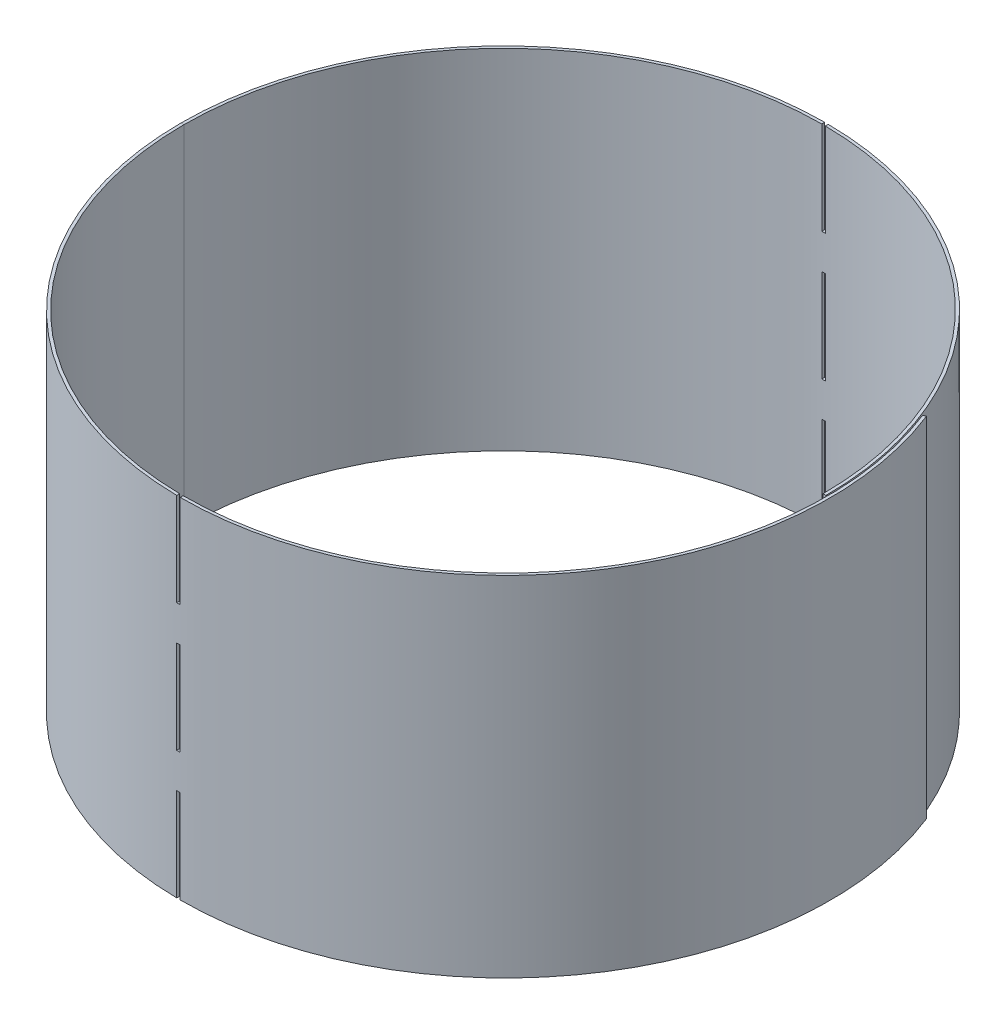
ISO-10303-21;
HEADER;
FILE_DESCRIPTION(('STEP AP214'),'2;1');
FILE_NAME('part.step','',(''),(''),'','','');
FILE_SCHEMA(('AUTOMOTIVE_DESIGN { 1 0 10303 214 1 1 1 1 }'));
ENDSEC;
DATA;
#1=APPLICATION_CONTEXT('core data for automotive mechanical design processes');
#2=APPLICATION_PROTOCOL_DEFINITION('international standard','automotive_design',2000,#1);
#3=PRODUCT_CONTEXT('',#1,'mechanical');
#4=PRODUCT('Part','Part','',(#3));
#5=PRODUCT_RELATED_PRODUCT_CATEGORY('part','',(#4));
#6=PRODUCT_DEFINITION_FORMATION('','',#4);
#7=PRODUCT_DEFINITION_CONTEXT('part definition',#1,'design');
#8=PRODUCT_DEFINITION('design','',#6,#7);
#9=PRODUCT_DEFINITION_SHAPE('','',#8);
#10=(LENGTH_UNIT() NAMED_UNIT(*) SI_UNIT(.MILLI.,.METRE.));
#11=(NAMED_UNIT(*) PLANE_ANGLE_UNIT() SI_UNIT($,.RADIAN.));
#12=(NAMED_UNIT(*) SI_UNIT($,.STERADIAN.) SOLID_ANGLE_UNIT());
#13=UNCERTAINTY_MEASURE_WITH_UNIT(LENGTH_MEASURE(1.E-05),#10,'distance_accuracy_value','');
#14=(GEOMETRIC_REPRESENTATION_CONTEXT(3) GLOBAL_UNCERTAINTY_ASSIGNED_CONTEXT((#13)) GLOBAL_UNIT_ASSIGNED_CONTEXT((#10,
#11,#12)) REPRESENTATION_CONTEXT('',''));
#15=CARTESIAN_POINT('',(0.,0.,0.));
#16=DIRECTION('',(0.,0.,1.));
#17=DIRECTION('',(1.,0.,0.));
#18=AXIS2_PLACEMENT_3D('',#15,#16,#17);
#19=CARTESIAN_POINT('',(0.,-19.,0.));
#20=DIRECTION('',(0.,-1.,0.));
#21=DIRECTION('',(0.,0.,-1.));
#22=AXIS2_PLACEMENT_3D('',#19,#20,#21);
#23=PLANE('',#22);
#24=DIRECTION('',(-0.00699536476308544,0.,0.999975532136578));
#25=VECTOR('',#24,1.);
#26=CARTESIAN_POINT('',(0.19237253098485,-19.,-27.4993271337559));
#27=LINE('',#26,#25);
#28=CARTESIAN_POINT('',(0.194121372175624,-18.9999999999999,-27.74932101679));
#29=VERTEX_POINT('',#28);
#30=CARTESIAN_POINT('',(0.19237253098485,-19.,-27.4993271337559));
#31=VERTEX_POINT('',#30);
#32=EDGE_CURVE('E143',#29,#31,#27,.T.);
#33=ORIENTED_EDGE('',*,*,#32,.F.);
#34=CARTESIAN_POINT('',(0.,-18.9999999999999,0.));
#35=DIRECTION('',(0.,-1.,0.));
#36=DIRECTION('',(0.,0.,-1.));
#37=AXIS2_PLACEMENT_3D('',#34,#35,#36);
#38=CIRCLE('',#37,27.75);
#39=CARTESIAN_POINT('',(-0.107234243740931,-18.9999999999999,-27.7497928067395));
#40=VERTEX_POINT('',#39);
#41=EDGE_CURVE('E395',#29,#40,#38,.F.);
#42=ORIENTED_EDGE('',*,*,#41,.T.);
#43=DIRECTION('',(0.00386429707174401,0.,0.999992533576197));
#44=VECTOR('',#43,1.);
#45=CARTESIAN_POINT('',(-0.10626816947296,-19.,-27.4997946733454));
#46=LINE('',#45,#44);
#47=CARTESIAN_POINT('',(-0.10626816947296,-19.,-27.4997946733454));
#48=VERTEX_POINT('',#47);
#49=EDGE_CURVE('E394',#40,#48,#46,.T.);
#50=ORIENTED_EDGE('',*,*,#49,.T.);
#51=CARTESIAN_POINT('',(0.,-19.,0.));
#52=DIRECTION('',(0.,1.,0.));
#53=DIRECTION('',(0.,0.,1.));
#54=AXIS2_PLACEMENT_3D('',#51,#52,#53);
#55=CIRCLE('',#54,27.5);
#56=EDGE_CURVE('E291',#31,#48,#55,.T.);
#57=ORIENTED_EDGE('',*,*,#56,.F.);
#58=EDGE_LOOP('',(#33,#42,#50,#57));
#59=FACE_BOUND('',#58,.T.);
#60=ADVANCED_FACE('F38',(#59),#23,.F.);
#61=CARTESIAN_POINT('',(0.192372530984853,-15.,-27.4993271337559));
#62=DIRECTION('',(0.999975532136578,0.,0.00699536476308556));
#63=DIRECTION('',(0.,-1.,0.));
#64=AXIS2_PLACEMENT_3D('',#61,#62,#63);
#65=PLANE('',#64);
#66=DIRECTION('',(-0.00699536476308569,0.,0.999975532136578));
#67=VECTOR('',#66,1.);
#68=CARTESIAN_POINT('',(0.192372530984856,-11.,-27.4993271337559));
#69=LINE('',#68,#67);
#70=CARTESIAN_POINT('',(0.194121372175624,-10.9999999999999,-27.74932101679));
#71=VERTEX_POINT('',#70);
#72=CARTESIAN_POINT('',(0.192372530984856,-11.,-27.4993271337559));
#73=VERTEX_POINT('',#72);
#74=EDGE_CURVE('E385',#71,#73,#69,.T.);
#75=ORIENTED_EDGE('',*,*,#74,.F.);
#76=DIRECTION('',(0.,-1.,0.));
#77=VECTOR('',#76,1.);
#78=CARTESIAN_POINT('',(0.194121372175624,76.8256966820841,-27.74932101679));
#79=LINE('',#78,#77);
#80=EDGE_CURVE('E391',#71,#29,#79,.T.);
#81=ORIENTED_EDGE('',*,*,#80,.T.);
#82=ORIENTED_EDGE('',*,*,#32,.T.);
#83=DIRECTION('',(0.,-1.,0.));
#84=VECTOR('',#83,1.);
#85=CARTESIAN_POINT('',(0.192372530984856,-11.,-27.4993271337559));
#86=LINE('',#85,#84);
#87=EDGE_CURVE('E294',#73,#31,#86,.T.);
#88=ORIENTED_EDGE('',*,*,#87,.F.);
#89=EDGE_LOOP('',(#75,#81,#82,#88));
#90=FACE_BOUND('',#89,.T.);
#91=ADVANCED_FACE('F571',(#90),#65,.F.);
#92=CARTESIAN_POINT('',(0.,-11.,0.));
#93=DIRECTION('',(0.,1.,0.));
#94=DIRECTION('',(0.,0.,1.));
#95=AXIS2_PLACEMENT_3D('',#92,#93,#94);
#96=PLANE('',#95);
#97=CARTESIAN_POINT('',(0.,-10.9999999999999,0.));
#98=DIRECTION('',(0.,-1.,0.));
#99=DIRECTION('',(0.,0.,-1.));
#100=AXIS2_PLACEMENT_3D('',#97,#98,#99);
#101=CIRCLE('',#100,27.75);
#102=CARTESIAN_POINT('',(-0.107234243740931,-10.9999999999999,-27.7497928067395));
#103=VERTEX_POINT('',#102);
#104=EDGE_CURVE('E387',#103,#71,#101,.T.);
#105=ORIENTED_EDGE('',*,*,#104,.T.);
#106=ORIENTED_EDGE('',*,*,#74,.T.);
#107=CARTESIAN_POINT('',(0.,-11.,0.));
#108=DIRECTION('',(0.,-1.,0.));
#109=DIRECTION('',(0.,0.,-1.));
#110=AXIS2_PLACEMENT_3D('',#107,#108,#109);
#111=CIRCLE('',#110,27.5);
#112=CARTESIAN_POINT('',(-0.106268169472984,-11.,-27.4997946733454));
#113=VERTEX_POINT('',#112);
#114=EDGE_CURVE('E297',#113,#73,#111,.T.);
#115=ORIENTED_EDGE('',*,*,#114,.F.);
#116=DIRECTION('',(0.00386429707174487,0.,0.999992533576197));
#117=VECTOR('',#116,1.);
#118=CARTESIAN_POINT('',(-0.106268169472984,-11.,-27.4997946733454));
#119=LINE('',#118,#117);
#120=EDGE_CURVE('E380',#103,#113,#119,.T.);
#121=ORIENTED_EDGE('',*,*,#120,.F.);
#122=EDGE_LOOP('',(#105,#106,#115,#121));
#123=FACE_BOUND('',#122,.T.);
#124=ADVANCED_FACE('F567',(#123),#96,.F.);
#125=CARTESIAN_POINT('',(-0.106268169472984,-15.,-27.4997946733454));
#126=DIRECTION('',(-0.999992533576197,0.,0.00386429707174487));
#127=DIRECTION('',(0.,1.,0.));
#128=AXIS2_PLACEMENT_3D('',#125,#126,#127);
#129=PLANE('',#128);
#130=ORIENTED_EDGE('',*,*,#49,.F.);
#131=DIRECTION('',(0.,-1.,0.));
#132=VECTOR('',#131,1.);
#133=CARTESIAN_POINT('',(-0.107234243740931,76.8256966820841,-27.7497928067395));
#134=LINE('',#133,#132);
#135=EDGE_CURVE('E382',#40,#103,#134,.F.);
#136=ORIENTED_EDGE('',*,*,#135,.T.);
#137=ORIENTED_EDGE('',*,*,#120,.T.);
#138=DIRECTION('',(0.,1.,0.));
#139=VECTOR('',#138,1.);
#140=CARTESIAN_POINT('',(-0.106268169472984,-19.,-27.4997946733454));
#141=LINE('',#140,#139);
#142=EDGE_CURVE('E300',#48,#113,#141,.T.);
#143=ORIENTED_EDGE('',*,*,#142,.F.);
#144=EDGE_LOOP('',(#130,#136,#137,#143));
#145=FACE_BOUND('',#144,.T.);
#146=ADVANCED_FACE('F560',(#145),#129,.F.);
#147=CARTESIAN_POINT('',(-0.106268169472977,-3.99999999999997,-27.4997946733454));
#148=DIRECTION('',(-0.999992533576197,0.,0.00386429707174462));
#149=DIRECTION('',(0.,1.,0.));
#150=AXIS2_PLACEMENT_3D('',#147,#148,#149);
#151=PLANE('',#150);
#152=DIRECTION('',(0.00386429707174401,0.,0.999992533576197));
#153=VECTOR('',#152,1.);
#154=CARTESIAN_POINT('',(-0.10626816947296,-7.99999999999997,-27.4997946733454));
#155=LINE('',#154,#153);
#156=CARTESIAN_POINT('',(-0.107234243740931,-7.99999999999992,-27.7497928067395));
#157=VERTEX_POINT('',#156);
#158=CARTESIAN_POINT('',(-0.10626816947296,-7.99999999999997,-27.4997946733454));
#159=VERTEX_POINT('',#158);
#160=EDGE_CURVE('E371',#157,#159,#155,.T.);
#161=ORIENTED_EDGE('',*,*,#160,.F.);
#162=DIRECTION('',(0.,-1.,0.));
#163=VECTOR('',#162,1.);
#164=CARTESIAN_POINT('',(-0.107234243740931,76.8256966820841,-27.7497928067395));
#165=LINE('',#164,#163);
#166=CARTESIAN_POINT('',(-0.107234243740931,0.,-27.7497928067395));
#167=VERTEX_POINT('',#166);
#168=EDGE_CURVE('E377',#157,#167,#165,.F.);
#169=ORIENTED_EDGE('',*,*,#168,.T.);
#170=DIRECTION('',(0.00386429707174462,0.,0.999992533576197));
#171=VECTOR('',#170,1.);
#172=CARTESIAN_POINT('',(-0.106268169472977,0.,-27.4997946733454));
#173=LINE('',#172,#171);
#174=CARTESIAN_POINT('',(-0.106268169472977,0.,-27.4997946733454));
#175=VERTEX_POINT('',#174);
#176=EDGE_CURVE('E57',#167,#175,#173,.T.);
#177=ORIENTED_EDGE('',*,*,#176,.T.);
#178=DIRECTION('',(0.,1.,0.));
#179=VECTOR('',#178,1.);
#180=CARTESIAN_POINT('',(-0.106268169472977,-7.99999999999997,-27.4997946733454));
#181=LINE('',#180,#179);
#182=EDGE_CURVE('E309',#159,#175,#181,.T.);
#183=ORIENTED_EDGE('',*,*,#182,.F.);
#184=EDGE_LOOP('',(#161,#169,#177,#183));
#185=FACE_BOUND('',#184,.T.);
#186=ADVANCED_FACE('F558',(#185),#151,.F.);
#187=CARTESIAN_POINT('',(0.,-7.99999999999997,0.));
#188=DIRECTION('',(0.,-1.,0.));
#189=DIRECTION('',(0.,0.,-1.));
#190=AXIS2_PLACEMENT_3D('',#187,#188,#189);
#191=PLANE('',#190);
#192=DIRECTION('',(-0.00699536476308569,0.,0.999975532136578));
#193=VECTOR('',#192,1.);
#194=CARTESIAN_POINT('',(0.192372530984856,-7.99999999999997,-27.4993271337559));
#195=LINE('',#194,#193);
#196=CARTESIAN_POINT('',(0.194121372175635,-7.99999999999992,-27.74932101679));
#197=VERTEX_POINT('',#196);
#198=CARTESIAN_POINT('',(0.192372530984856,-7.99999999999997,-27.4993271337559));
#199=VERTEX_POINT('',#198);
#200=EDGE_CURVE('E366',#197,#199,#195,.T.);
#201=ORIENTED_EDGE('',*,*,#200,.F.);
#202=CARTESIAN_POINT('',(0.,-7.99999999999994,0.));
#203=DIRECTION('',(0.,-1.,0.));
#204=DIRECTION('',(0.,0.,-1.));
#205=AXIS2_PLACEMENT_3D('',#202,#203,#204);
#206=CIRCLE('',#205,27.75);
#207=EDGE_CURVE('E373',#197,#157,#206,.F.);
#208=ORIENTED_EDGE('',*,*,#207,.T.);
#209=ORIENTED_EDGE('',*,*,#160,.T.);
#210=CARTESIAN_POINT('',(0.,-7.99999999999997,0.));
#211=DIRECTION('',(0.,1.,0.));
#212=DIRECTION('',(0.,0.,1.));
#213=AXIS2_PLACEMENT_3D('',#210,#211,#212);
#214=CIRCLE('',#213,27.5);
#215=EDGE_CURVE('E312',#199,#159,#214,.T.);
#216=ORIENTED_EDGE('',*,*,#215,.F.);
#217=EDGE_LOOP('',(#201,#208,#209,#216));
#218=FACE_BOUND('',#217,.T.);
#219=ADVANCED_FACE('F556',(#218),#191,.F.);
#220=CARTESIAN_POINT('',(0.192372530984863,-3.99999999999997,-27.4993271337559));
#221=DIRECTION('',(0.999975532136578,0.,0.00699536476308594));
#222=DIRECTION('',(0.,-1.,0.));
#223=AXIS2_PLACEMENT_3D('',#220,#221,#222);
#224=PLANE('',#223);
#225=DIRECTION('',(-0.00699536476308647,0.,0.999975532136578));
#226=VECTOR('',#225,1.);
#227=CARTESIAN_POINT('',(0.192372530984878,0.,-27.4993271337559));
#228=LINE('',#227,#226);
#229=CARTESIAN_POINT('',(0.194121372175635,0.,-27.74932101679));
#230=VERTEX_POINT('',#229);
#231=CARTESIAN_POINT('',(0.192372530984878,0.,-27.4993271337559));
#232=VERTEX_POINT('',#231);
#233=EDGE_CURVE('E361',#230,#232,#228,.T.);
#234=ORIENTED_EDGE('',*,*,#233,.F.);
#235=DIRECTION('',(0.,-1.,0.));
#236=VECTOR('',#235,1.);
#237=CARTESIAN_POINT('',(0.194121372175635,76.8256966820841,-27.74932101679));
#238=LINE('',#237,#236);
#239=EDGE_CURVE('E368',#230,#197,#238,.T.);
#240=ORIENTED_EDGE('',*,*,#239,.T.);
#241=ORIENTED_EDGE('',*,*,#200,.T.);
#242=DIRECTION('',(0.,-1.,0.));
#243=VECTOR('',#242,1.);
#244=CARTESIAN_POINT('',(0.19237253098487,0.,-27.4993271337559));
#245=LINE('',#244,#243);
#246=EDGE_CURVE('E315',#232,#199,#245,.T.);
#247=ORIENTED_EDGE('',*,*,#246,.F.);
#248=EDGE_LOOP('',(#234,#240,#241,#247));
#249=FACE_BOUND('',#248,.T.);
#250=ADVANCED_FACE('F554',(#249),#224,.F.);
#251=CARTESIAN_POINT('',(0.,0.,0.));
#252=DIRECTION('',(0.,-1.,0.));
#253=DIRECTION('',(1.,0.,0.));
#254=AXIS2_PLACEMENT_3D('',#251,#252,#253);
#255=PLANE('',#254);
#256=DIRECTION('',(-1.,0.,0.));
#257=VECTOR('',#256,1.);
#258=CARTESIAN_POINT('',(27.5,0.,0.));
#259=LINE('',#258,#257);
#260=CARTESIAN_POINT('',(27.75,0.,0.));
#261=VERTEX_POINT('',#260);
#262=CARTESIAN_POINT('',(27.5,0.,0.));
#263=VERTEX_POINT('',#262);
#264=EDGE_CURVE('E356',#261,#263,#259,.T.);
#265=ORIENTED_EDGE('',*,*,#264,.F.);
#266=CARTESIAN_POINT('',(0.,0.,0.));
#267=DIRECTION('',(0.,-1.,0.));
#268=DIRECTION('',(0.,0.,-1.));
#269=AXIS2_PLACEMENT_3D('',#266,#267,#268);
#270=CIRCLE('',#269,27.75);
#271=EDGE_CURVE('E363',#261,#230,#270,.F.);
#272=ORIENTED_EDGE('',*,*,#271,.T.);
#273=ORIENTED_EDGE('',*,*,#233,.T.);
#274=CARTESIAN_POINT('',(0.,0.,0.));
#275=DIRECTION('',(0.,1.,0.));
#276=DIRECTION('',(-1.,0.,0.));
#277=AXIS2_PLACEMENT_3D('',#274,#275,#276);
#278=CIRCLE('',#277,27.5);
#279=EDGE_CURVE('E318',#263,#232,#278,.T.);
#280=ORIENTED_EDGE('',*,*,#279,.F.);
#281=EDGE_LOOP('',(#265,#272,#273,#280));
#282=FACE_BOUND('',#281,.T.);
#283=ADVANCED_FACE('F549',(#282),#255,.F.);
#284=CARTESIAN_POINT('',(27.5,-15.,0.));
#285=DIRECTION('',(0.,0.,-1.));
#286=DIRECTION('',(0.,1.,0.));
#287=AXIS2_PLACEMENT_3D('',#284,#285,#286);
#288=PLANE('',#287);
#289=DIRECTION('',(-1.,0.,0.));
#290=VECTOR('',#289,1.);
#291=CARTESIAN_POINT('',(27.5,-30.,0.));
#292=LINE('',#291,#290);
#293=CARTESIAN_POINT('',(27.75,-29.9999999999999,0.));
#294=VERTEX_POINT('',#293);
#295=CARTESIAN_POINT('',(27.5,-30.,0.));
#296=VERTEX_POINT('',#295);
#297=EDGE_CURVE('E351',#294,#296,#292,.T.);
#298=ORIENTED_EDGE('',*,*,#297,.F.);
#299=DIRECTION('',(0.,-1.,0.));
#300=VECTOR('',#299,1.);
#301=CARTESIAN_POINT('',(27.75,76.8256966820841,0.));
#302=LINE('',#301,#300);
#303=EDGE_CURVE('E358',#294,#261,#302,.F.);
#304=ORIENTED_EDGE('',*,*,#303,.T.);
#305=ORIENTED_EDGE('',*,*,#264,.T.);
#306=DIRECTION('',(0.,1.,0.));
#307=VECTOR('',#306,1.);
#308=CARTESIAN_POINT('',(27.5,-30.,0.));
#309=LINE('',#308,#307);
#310=EDGE_CURVE('E321',#296,#263,#309,.T.);
#311=ORIENTED_EDGE('',*,*,#310,.F.);
#312=EDGE_LOOP('',(#298,#304,#305,#311));
#313=FACE_BOUND('',#312,.T.);
#314=ADVANCED_FACE('F543',(#313),#288,.F.);
#315=CARTESIAN_POINT('',(0.,-30.,0.));
#316=DIRECTION('',(0.,1.,0.));
#317=DIRECTION('',(0.,0.,1.));
#318=AXIS2_PLACEMENT_3D('',#315,#316,#317);
#319=PLANE('',#318);
#320=DIRECTION('',(-0.00699536476308506,0.,0.999975532136578));
#321=VECTOR('',#320,1.);
#322=CARTESIAN_POINT('',(0.192372530984839,-30.,-27.4993271337559));
#323=LINE('',#322,#321);
#324=CARTESIAN_POINT('',(0.194121372175614,-29.9999999999999,-27.74932101679));
#325=VERTEX_POINT('',#324);
#326=CARTESIAN_POINT('',(0.192372530984839,-30.,-27.4993271337559));
#327=VERTEX_POINT('',#326);
#328=EDGE_CURVE('E346',#325,#327,#323,.T.);
#329=ORIENTED_EDGE('',*,*,#328,.F.);
#330=CARTESIAN_POINT('',(0.,-29.9999999999999,0.));
#331=DIRECTION('',(0.,-1.,0.));
#332=DIRECTION('',(0.,0.,-1.));
#333=AXIS2_PLACEMENT_3D('',#330,#331,#332);
#334=CIRCLE('',#333,27.75);
#335=EDGE_CURVE('E353',#325,#294,#334,.T.);
#336=ORIENTED_EDGE('',*,*,#335,.T.);
#337=ORIENTED_EDGE('',*,*,#297,.T.);
#338=CARTESIAN_POINT('',(0.,-30.,0.));
#339=DIRECTION('',(0.,-1.,0.));
#340=DIRECTION('',(0.,0.,-1.));
#341=AXIS2_PLACEMENT_3D('',#338,#339,#340);
#342=CIRCLE('',#341,27.5);
#343=EDGE_CURVE('E324',#327,#296,#342,.T.);
#344=ORIENTED_EDGE('',*,*,#343,.F.);
#345=EDGE_LOOP('',(#329,#336,#337,#344));
#346=FACE_BOUND('',#345,.T.);
#347=ADVANCED_FACE('F539',(#346),#319,.F.);
#348=CARTESIAN_POINT('',(0.192372530984843,-26.,-27.4993271337559));
#349=DIRECTION('',(0.999975532136578,0.,0.00699536476308519));
#350=DIRECTION('',(0.,-1.,0.));
#351=AXIS2_PLACEMENT_3D('',#348,#349,#350);
#352=PLANE('',#351);
#353=DIRECTION('',(-0.00699536476308531,0.,0.999975532136578));
#354=VECTOR('',#353,1.);
#355=CARTESIAN_POINT('',(0.192372530984846,-22.,-27.4993271337559));
#356=LINE('',#355,#354);
#357=CARTESIAN_POINT('',(0.194121372175614,-22.,-27.74932101679));
#358=VERTEX_POINT('',#357);
#359=CARTESIAN_POINT('',(0.192372530984846,-22.,-27.4993271337559));
#360=VERTEX_POINT('',#359);
#361=EDGE_CURVE('E341',#358,#360,#356,.T.);
#362=ORIENTED_EDGE('',*,*,#361,.F.);
#363=DIRECTION('',(0.,-1.,0.));
#364=VECTOR('',#363,1.);
#365=CARTESIAN_POINT('',(0.194121372175614,76.8256966820841,-27.74932101679));
#366=LINE('',#365,#364);
#367=EDGE_CURVE('E348',#358,#325,#366,.T.);
#368=ORIENTED_EDGE('',*,*,#367,.T.);
#369=ORIENTED_EDGE('',*,*,#328,.T.);
#370=DIRECTION('',(0.,-1.,0.));
#371=VECTOR('',#370,1.);
#372=CARTESIAN_POINT('',(0.192372530984846,-22.,-27.4993271337559));
#373=LINE('',#372,#371);
#374=EDGE_CURVE('E327',#360,#327,#373,.T.);
#375=ORIENTED_EDGE('',*,*,#374,.F.);
#376=EDGE_LOOP('',(#362,#368,#369,#375));
#377=FACE_BOUND('',#376,.T.);
#378=ADVANCED_FACE('F743',(#377),#352,.F.);
#379=CARTESIAN_POINT('',(0.,-22.,0.));
#380=DIRECTION('',(0.,1.,0.));
#381=DIRECTION('',(0.,0.,1.));
#382=AXIS2_PLACEMENT_3D('',#379,#380,#381);
#383=PLANE('',#382);
#384=CARTESIAN_POINT('',(0.,-22.,0.));
#385=DIRECTION('',(0.,-1.,0.));
#386=DIRECTION('',(0.,0.,-1.));
#387=AXIS2_PLACEMENT_3D('',#384,#385,#386);
#388=CIRCLE('',#387,27.75);
#389=CARTESIAN_POINT('',(-0.107234243740931,-22.,-27.7497928067395));
#390=VERTEX_POINT('',#389);
#391=EDGE_CURVE('E343',#390,#358,#388,.T.);
#392=ORIENTED_EDGE('',*,*,#391,.T.);
#393=ORIENTED_EDGE('',*,*,#361,.T.);
#394=CARTESIAN_POINT('',(0.,-22.,0.));
#395=DIRECTION('',(0.,-1.,0.));
#396=DIRECTION('',(0.,0.,-1.));
#397=AXIS2_PLACEMENT_3D('',#394,#395,#396);
#398=CIRCLE('',#397,27.5);
#399=CARTESIAN_POINT('',(-0.106268169472994,-22.,-27.4997946733454));
#400=VERTEX_POINT('',#399);
#401=EDGE_CURVE('E330',#400,#360,#398,.T.);
#402=ORIENTED_EDGE('',*,*,#401,.F.);
#403=DIRECTION('',(0.00386429707174525,0.,0.999992533576197));
#404=VECTOR('',#403,1.);
#405=CARTESIAN_POINT('',(-0.106268169472994,-22.,-27.4997946733454));
#406=LINE('',#405,#404);
#407=EDGE_CURVE('E336',#390,#400,#406,.T.);
#408=ORIENTED_EDGE('',*,*,#407,.F.);
#409=EDGE_LOOP('',(#392,#393,#402,#408));
#410=FACE_BOUND('',#409,.T.);
#411=ADVANCED_FACE('F533',(#410),#383,.F.);
#412=CARTESIAN_POINT('',(-0.106268169472994,-26.,-27.4997946733454));
#413=DIRECTION('',(-0.999992533576197,0.,0.00386429707174525));
#414=DIRECTION('',(0.,1.,0.));
#415=AXIS2_PLACEMENT_3D('',#412,#413,#414);
#416=PLANE('',#415);
#417=DIRECTION('',(0.00386429707174527,0.,0.999992533576197));
#418=VECTOR('',#417,1.);
#419=CARTESIAN_POINT('',(-0.106268169472995,-30.,-27.4997946733454));
#420=LINE('',#419,#418);
#421=CARTESIAN_POINT('',(-0.107234243740931,-29.9999999999999,-27.7497928067395));
#422=VERTEX_POINT('',#421);
#423=CARTESIAN_POINT('',(-0.106268169472995,-30.,-27.4997946733454));
#424=VERTEX_POINT('',#423);
#425=EDGE_CURVE('E283',#422,#424,#420,.T.);
#426=ORIENTED_EDGE('',*,*,#425,.F.);
#427=DIRECTION('',(0.,-1.,0.));
#428=VECTOR('',#427,1.);
#429=CARTESIAN_POINT('',(-0.107234243740931,76.8256966820841,-27.7497928067395));
#430=LINE('',#429,#428);
#431=EDGE_CURVE('E338',#422,#390,#430,.F.);
#432=ORIENTED_EDGE('',*,*,#431,.T.);
#433=ORIENTED_EDGE('',*,*,#407,.T.);
#434=DIRECTION('',(0.,1.,0.));
#435=VECTOR('',#434,1.);
#436=CARTESIAN_POINT('',(-0.106268169472994,-30.,-27.4997946733454));
#437=LINE('',#436,#435);
#438=EDGE_CURVE('E333',#424,#400,#437,.T.);
#439=ORIENTED_EDGE('',*,*,#438,.F.);
#440=EDGE_LOOP('',(#426,#432,#433,#439));
#441=FACE_BOUND('',#440,.T.);
#442=ADVANCED_FACE('F530',(#441),#416,.F.);
#443=CARTESIAN_POINT('',(0.,76.8256966820841,0.));
#444=DIRECTION('',(0.,-1.,0.));
#445=DIRECTION('',(0.,0.,-1.));
#446=AXIS2_PLACEMENT_3D('',#443,#444,#445);
#447=CYLINDRICAL_SURFACE('',#446,27.5);
#448=ORIENTED_EDGE('',*,*,#438,.T.);
#449=ORIENTED_EDGE('',*,*,#401,.T.);
#450=ORIENTED_EDGE('',*,*,#374,.T.);
#451=ORIENTED_EDGE('',*,*,#343,.T.);
#452=ORIENTED_EDGE('',*,*,#310,.T.);
#453=ORIENTED_EDGE('',*,*,#279,.T.);
#454=ORIENTED_EDGE('',*,*,#246,.T.);
#455=ORIENTED_EDGE('',*,*,#215,.T.);
#456=ORIENTED_EDGE('',*,*,#182,.T.);
#457=CARTESIAN_POINT('',(0.,0.,0.));
#458=DIRECTION('',(0.,1.,0.));
#459=DIRECTION('',(0.,0.,1.));
#460=AXIS2_PLACEMENT_3D('',#457,#458,#459);
#461=CIRCLE('',#460,27.5);
#462=CARTESIAN_POINT('',(-27.5,0.,1.64365770551858E-13));
#463=VERTEX_POINT('',#462);
#464=EDGE_CURVE('E306',#175,#463,#461,.T.);
#465=ORIENTED_EDGE('',*,*,#464,.T.);
#466=DIRECTION('',(0.,1.,0.));
#467=VECTOR('',#466,1.);
#468=CARTESIAN_POINT('',(-27.5,-30.,-3.60822483003176E-13));
#469=LINE('',#468,#467);
#470=CARTESIAN_POINT('',(-27.5,-30.,-1.78551380066128E-13));
#471=VERTEX_POINT('',#470);
#472=EDGE_CURVE('E42',#471,#463,#469,.T.);
#473=ORIENTED_EDGE('',*,*,#472,.F.);
#474=CARTESIAN_POINT('',(0.,-30.,0.));
#475=DIRECTION('',(0.,-1.,0.));
#476=DIRECTION('',(0.,0.,-1.));
#477=AXIS2_PLACEMENT_3D('',#474,#475,#476);
#478=CIRCLE('',#477,27.5);
#479=EDGE_CURVE('E303',#471,#424,#478,.T.);
#480=ORIENTED_EDGE('',*,*,#479,.T.);
#481=EDGE_LOOP('',(#448,#449,#450,#451,#452,#453,#454,#455,#456,#465,#473,#480));
#482=FACE_BOUND('',#481,.T.);
#483=ORIENTED_EDGE('',*,*,#142,.T.);
#484=ORIENTED_EDGE('',*,*,#114,.T.);
#485=ORIENTED_EDGE('',*,*,#87,.T.);
#486=ORIENTED_EDGE('',*,*,#56,.T.);
#487=EDGE_LOOP('',(#483,#484,#485,#486));
#488=FACE_BOUND('',#487,.T.);
#489=ADVANCED_FACE('F421',(#482,#488),#447,.F.);
#490=CARTESIAN_POINT('',(0.,-30.,0.));
#491=DIRECTION('',(0.,1.,0.));
#492=DIRECTION('',(0.,0.,1.));
#493=AXIS2_PLACEMENT_3D('',#490,#491,#492);
#494=PLANE('',#493);
#495=DIRECTION('',(-1.,0.,0.));
#496=VECTOR('',#495,1.);
#497=CARTESIAN_POINT('',(-27.5,-30.,-3.60822483003176E-13));
#498=LINE('',#497,#496);
#499=CARTESIAN_POINT('',(-27.75,-30.,-3.60822483003176E-13));
#500=VERTEX_POINT('',#499);
#501=EDGE_CURVE('E288',#471,#500,#498,.T.);
#502=ORIENTED_EDGE('',*,*,#501,.T.);
#503=CARTESIAN_POINT('',(0.,-29.9999999999999,0.));
#504=DIRECTION('',(0.,-1.,0.));
#505=DIRECTION('',(0.,0.,-1.));
#506=AXIS2_PLACEMENT_3D('',#503,#504,#505);
#507=CIRCLE('',#506,27.75);
#508=EDGE_CURVE('E285',#500,#422,#507,.T.);
#509=ORIENTED_EDGE('',*,*,#508,.T.);
#510=ORIENTED_EDGE('',*,*,#425,.T.);
#511=ORIENTED_EDGE('',*,*,#479,.F.);
#512=EDGE_LOOP('',(#502,#509,#510,#511));
#513=FACE_BOUND('',#512,.T.);
#514=ADVANCED_FACE('F526',(#513),#494,.F.);
#515=CARTESIAN_POINT('',(0.,76.8256966820841,0.));
#516=DIRECTION('',(0.,-1.,0.));
#517=DIRECTION('',(0.,0.,-1.));
#518=AXIS2_PLACEMENT_3D('',#515,#516,#517);
#519=CYLINDRICAL_SURFACE('',#518,27.75);
#520=ORIENTED_EDGE('',*,*,#431,.F.);
#521=ORIENTED_EDGE('',*,*,#508,.F.);
#522=DIRECTION('',(0.,1.,0.));
#523=VECTOR('',#522,1.);
#524=CARTESIAN_POINT('',(-27.75,-30.,-3.60822483003176E-13));
#525=LINE('',#524,#523);
#526=CARTESIAN_POINT('',(-27.75,0.,0.));
#527=VERTEX_POINT('',#526);
#528=EDGE_CURVE('E280',#500,#527,#525,.T.);
#529=ORIENTED_EDGE('',*,*,#528,.T.);
#530=CARTESIAN_POINT('',(0.,0.,0.));
#531=DIRECTION('',(0.,-1.,0.));
#532=DIRECTION('',(0.,0.,-1.));
#533=AXIS2_PLACEMENT_3D('',#530,#531,#532);
#534=CIRCLE('',#533,27.75);
#535=EDGE_CURVE('E48',#167,#527,#534,.F.);
#536=ORIENTED_EDGE('',*,*,#535,.F.);
#537=ORIENTED_EDGE('',*,*,#168,.F.);
#538=ORIENTED_EDGE('',*,*,#207,.F.);
#539=ORIENTED_EDGE('',*,*,#239,.F.);
#540=ORIENTED_EDGE('',*,*,#271,.F.);
#541=ORIENTED_EDGE('',*,*,#303,.F.);
#542=ORIENTED_EDGE('',*,*,#335,.F.);
#543=ORIENTED_EDGE('',*,*,#367,.F.);
#544=ORIENTED_EDGE('',*,*,#391,.F.);
#545=EDGE_LOOP('',(#520,#521,#529,#536,#537,#538,#539,#540,#541,#542,#543,#544));
#546=FACE_BOUND('',#545,.T.);
#547=ORIENTED_EDGE('',*,*,#135,.F.);
#548=ORIENTED_EDGE('',*,*,#41,.F.);
#549=ORIENTED_EDGE('',*,*,#80,.F.);
#550=ORIENTED_EDGE('',*,*,#104,.F.);
#551=EDGE_LOOP('',(#547,#548,#549,#550));
#552=FACE_BOUND('',#551,.T.);
#553=ADVANCED_FACE('F428',(#546,#552),#519,.T.);
#554=CARTESIAN_POINT('',(0.,0.,0.));
#555=DIRECTION('',(0.,-1.,0.));
#556=DIRECTION('',(0.,0.,-1.));
#557=AXIS2_PLACEMENT_3D('',#554,#555,#556);
#558=PLANE('',#557);
#559=ORIENTED_EDGE('',*,*,#176,.F.);
#560=ORIENTED_EDGE('',*,*,#535,.T.);
#561=DIRECTION('',(1.,0.,0.));
#562=VECTOR('',#561,1.);
#563=CARTESIAN_POINT('',(-27.75,0.,-3.60822483003176E-13));
#564=LINE('',#563,#562);
#565=EDGE_CURVE('E11',#527,#463,#564,.T.);
#566=ORIENTED_EDGE('',*,*,#565,.T.);
#567=ORIENTED_EDGE('',*,*,#464,.F.);
#568=EDGE_LOOP('',(#559,#560,#566,#567));
#569=FACE_BOUND('',#568,.T.);
#570=ADVANCED_FACE('F40',(#569),#558,.F.);
#571=CARTESIAN_POINT('',(-0.181549779073126,-15.,27.6788655916625));
#572=DIRECTION('',(-0.999914111510431,0.,-0.0131060902753222));
#573=DIRECTION('',(0.,-1.,0.));
#574=AXIS2_PLACEMENT_3D('',#571,#572,#573);
#575=PLANE('',#574);
#576=DIRECTION('',(0.0131060902753222,0.,-0.999914111510431));
#577=VECTOR('',#576,1.);
#578=CARTESIAN_POINT('',(-0.181549779073126,-11.,27.6788655916625));
#579=LINE('',#578,#577);
#580=CARTESIAN_POINT('',(-0.184826301641953,-11.,27.9288441195401));
#581=VERTEX_POINT('',#580);
#582=CARTESIAN_POINT('',(-0.181549779073126,-11.,27.6788655916625));
#583=VERTEX_POINT('',#582);
#584=EDGE_CURVE('E210',#581,#583,#579,.T.);
#585=ORIENTED_EDGE('',*,*,#584,.F.);
#586=DIRECTION('',(0.,-1.,0.));
#587=VECTOR('',#586,1.);
#588=CARTESIAN_POINT('',(-0.184826301641953,87.2700966565554,27.9288441195401));
#589=LINE('',#588,#587);
#590=CARTESIAN_POINT('',(-0.184826301641953,-19.,27.9288441195401));
#591=VERTEX_POINT('',#590);
#592=EDGE_CURVE('E214',#581,#591,#589,.T.);
#593=ORIENTED_EDGE('',*,*,#592,.T.);
#594=DIRECTION('',(0.0131060902753222,0.,-0.999914111510431));
#595=VECTOR('',#594,1.);
#596=CARTESIAN_POINT('',(-0.181549779073126,-19.,27.6788655916625));
#597=LINE('',#596,#595);
#598=CARTESIAN_POINT('',(-0.181549779073126,-19.,27.6788655916625));
#599=VERTEX_POINT('',#598);
#600=EDGE_CURVE('E222',#591,#599,#597,.T.);
#601=ORIENTED_EDGE('',*,*,#600,.T.);
#602=DIRECTION('',(0.,-1.,0.));
#603=VECTOR('',#602,1.);
#604=CARTESIAN_POINT('',(-0.181549779073126,-11.,27.6788655916625));
#605=LINE('',#604,#603);
#606=EDGE_CURVE('E217',#583,#599,#605,.T.);
#607=ORIENTED_EDGE('',*,*,#606,.F.);
#608=EDGE_LOOP('',(#585,#593,#601,#607));
#609=FACE_BOUND('',#608,.T.);
#610=ADVANCED_FACE('F212',(#609),#575,.F.);
#611=CARTESIAN_POINT('',(0.181243091821423,-19.,-3.55737521140853E-13));
#612=DIRECTION('',(0.,-1.,0.));
#613=DIRECTION('',(0.,0.,-1.));
#614=AXIS2_PLACEMENT_3D('',#611,#612,#613);
#615=PLANE('',#614);
#616=ORIENTED_EDGE('',*,*,#600,.F.);
#617=CARTESIAN_POINT('',(0.181243091821423,-19.,-3.55737521140853E-13));
#618=DIRECTION('',(0.,-1.,0.));
#619=DIRECTION('',(0.,0.,-1.));
#620=AXIS2_PLACEMENT_3D('',#617,#618,#619);
#621=CIRCLE('',#620,27.9312430918214);
#622=CARTESIAN_POINT('',(0.116511893561713,-19.,27.9311680838159));
#623=VERTEX_POINT('',#622);
#624=EDGE_CURVE('E231',#591,#623,#621,.F.);
#625=ORIENTED_EDGE('',*,*,#624,.T.);
#626=DIRECTION('',(0.00231751941891461,0.,-0.999997314548266));
#627=VECTOR('',#626,1.);
#628=CARTESIAN_POINT('',(0.117091273416431,-19.,27.6811687551788));
#629=LINE('',#628,#627);
#630=CARTESIAN_POINT('',(0.117091273416431,-19.,27.6811687551788));
#631=VERTEX_POINT('',#630);
#632=EDGE_CURVE('E275',#623,#631,#629,.T.);
#633=ORIENTED_EDGE('',*,*,#632,.T.);
#634=CARTESIAN_POINT('',(0.181243091821423,-19.,-3.55737521140853E-13));
#635=DIRECTION('',(0.,1.,0.));
#636=DIRECTION('',(0.,0.,1.));
#637=AXIS2_PLACEMENT_3D('',#634,#635,#636);
#638=CIRCLE('',#637,27.6812430918214);
#639=EDGE_CURVE('E453',#599,#631,#638,.T.);
#640=ORIENTED_EDGE('',*,*,#639,.F.);
#641=EDGE_LOOP('',(#616,#625,#633,#640));
#642=FACE_BOUND('',#641,.T.);
#643=ADVANCED_FACE('F450',(#642),#615,.F.);
#644=CARTESIAN_POINT('',(0.117091273416432,-15.,27.6811687551788));
#645=DIRECTION('',(0.999997314548266,0.,0.00231751941891457));
#646=DIRECTION('',(0.,1.,0.));
#647=AXIS2_PLACEMENT_3D('',#644,#645,#646);
#648=PLANE('',#647);
#649=ORIENTED_EDGE('',*,*,#632,.F.);
#650=DIRECTION('',(0.,-1.,0.));
#651=VECTOR('',#650,1.);
#652=CARTESIAN_POINT('',(0.116511893561713,87.2700966565554,27.9311680838159));
#653=LINE('',#652,#651);
#654=CARTESIAN_POINT('',(0.116511893561713,-11.,27.9311680838159));
#655=VERTEX_POINT('',#654);
#656=EDGE_CURVE('E236',#623,#655,#653,.F.);
#657=ORIENTED_EDGE('',*,*,#656,.T.);
#658=DIRECTION('',(0.00231751941891457,0.,-0.999997314548266));
#659=VECTOR('',#658,1.);
#660=CARTESIAN_POINT('',(0.117091273416432,-11.,27.6811687551788));
#661=LINE('',#660,#659);
#662=CARTESIAN_POINT('',(0.117091273416432,-11.,27.6811687551788));
#663=VERTEX_POINT('',#662);
#664=EDGE_CURVE('E160',#655,#663,#661,.T.);
#665=ORIENTED_EDGE('',*,*,#664,.T.);
#666=DIRECTION('',(0.,1.,0.));
#667=VECTOR('',#666,1.);
#668=CARTESIAN_POINT('',(0.117091273416432,-19.,27.6811687551788));
#669=LINE('',#668,#667);
#670=EDGE_CURVE('E456',#631,#663,#669,.T.);
#671=ORIENTED_EDGE('',*,*,#670,.F.);
#672=EDGE_LOOP('',(#649,#657,#665,#671));
#673=FACE_BOUND('',#672,.T.);
#674=ADVANCED_FACE('F610',(#673),#648,.F.);
#675=CARTESIAN_POINT('',(-0.181549779073126,-26.,27.6788655916625));
#676=DIRECTION('',(-0.999914111510431,0.,-0.0131060902753222));
#677=DIRECTION('',(0.,-1.,0.));
#678=AXIS2_PLACEMENT_3D('',#675,#676,#677);
#679=PLANE('',#678);
#680=DIRECTION('',(0.0131060902753222,0.,-0.999914111510431));
#681=VECTOR('',#680,1.);
#682=CARTESIAN_POINT('',(-0.181549779073126,-22.,27.6788655916625));
#683=LINE('',#682,#681);
#684=CARTESIAN_POINT('',(-0.184826301641953,-22.,27.9288441195401));
#685=VERTEX_POINT('',#684);
#686=CARTESIAN_POINT('',(-0.181549779073126,-22.,27.6788655916625));
#687=VERTEX_POINT('',#686);
#688=EDGE_CURVE('E269',#685,#687,#683,.T.);
#689=ORIENTED_EDGE('',*,*,#688,.F.);
#690=DIRECTION('',(0.,-1.,0.));
#691=VECTOR('',#690,1.);
#692=CARTESIAN_POINT('',(-0.184826301641953,87.2700966565554,27.9288441195401));
#693=LINE('',#692,#691);
#694=CARTESIAN_POINT('',(-0.184826301641953,-30.,27.9288441195401));
#695=VERTEX_POINT('',#694);
#696=EDGE_CURVE('E442',#685,#695,#693,.T.);
#697=ORIENTED_EDGE('',*,*,#696,.T.);
#698=DIRECTION('',(0.0131060902753222,0.,-0.999914111510431));
#699=VECTOR('',#698,1.);
#700=CARTESIAN_POINT('',(-0.181549779073126,-30.,27.6788655916625));
#701=LINE('',#700,#699);
#702=CARTESIAN_POINT('',(-0.181549779073126,-30.,27.6788655916625));
#703=VERTEX_POINT('',#702);
#704=EDGE_CURVE('E266',#695,#703,#701,.T.);
#705=ORIENTED_EDGE('',*,*,#704,.T.);
#706=DIRECTION('',(0.,-1.,0.));
#707=VECTOR('',#706,1.);
#708=CARTESIAN_POINT('',(-0.181549779073126,-22.,27.6788655916625));
#709=LINE('',#708,#707);
#710=EDGE_CURVE('E235',#687,#703,#709,.T.);
#711=ORIENTED_EDGE('',*,*,#710,.F.);
#712=EDGE_LOOP('',(#689,#697,#705,#711));
#713=FACE_BOUND('',#712,.T.);
#714=ADVANCED_FACE('F521',(#713),#679,.F.);
#715=CARTESIAN_POINT('',(0.181243091821423,-30.,-3.55737521140853E-13));
#716=DIRECTION('',(0.,1.,0.));
#717=DIRECTION('',(0.,0.,1.));
#718=AXIS2_PLACEMENT_3D('',#715,#716,#717);
#719=PLANE('',#718);
#720=ORIENTED_EDGE('',*,*,#704,.F.);
#721=CARTESIAN_POINT('',(0.181243091821423,-30.,-3.55737521140853E-13));
#722=DIRECTION('',(0.,-1.,0.));
#723=DIRECTION('',(0.,0.,-1.));
#724=AXIS2_PLACEMENT_3D('',#721,#722,#723);
#725=CIRCLE('',#724,27.9312430918214);
#726=EDGE_CURVE('E151',#695,#500,#725,.T.);
#727=ORIENTED_EDGE('',*,*,#726,.T.);
#728=ORIENTED_EDGE('',*,*,#501,.F.);
#729=CARTESIAN_POINT('',(0.181243091821423,-30.,-3.55737521140853E-13));
#730=DIRECTION('',(0.,-1.,0.));
#731=DIRECTION('',(0.,0.,-1.));
#732=AXIS2_PLACEMENT_3D('',#729,#730,#731);
#733=CIRCLE('',#732,27.6812430918214);
#734=EDGE_CURVE('E239',#703,#471,#733,.T.);
#735=ORIENTED_EDGE('',*,*,#734,.F.);
#736=EDGE_LOOP('',(#720,#727,#728,#735));
#737=FACE_BOUND('',#736,.T.);
#738=ADVANCED_FACE('F523',(#737),#719,.F.);
#739=CARTESIAN_POINT('',(0.181243091821423,0.,-3.55737521140853E-13));
#740=DIRECTION('',(0.,-1.,0.));
#741=DIRECTION('',(0.,0.,-1.));
#742=AXIS2_PLACEMENT_3D('',#739,#740,#741);
#743=PLANE('',#742);
#744=ORIENTED_EDGE('',*,*,#565,.F.);
#745=CARTESIAN_POINT('',(0.181243091821423,0.,-3.55737521140853E-13));
#746=DIRECTION('',(0.,-1.,0.));
#747=DIRECTION('',(0.,0.,-1.));
#748=AXIS2_PLACEMENT_3D('',#745,#746,#747);
#749=CIRCLE('',#748,27.9312430918214);
#750=CARTESIAN_POINT('',(-0.184826301641965,0.,27.9288441195401));
#751=VERTEX_POINT('',#750);
#752=EDGE_CURVE('E435',#527,#751,#749,.F.);
#753=ORIENTED_EDGE('',*,*,#752,.T.);
#754=DIRECTION('',(0.0131060902753233,0.,-0.999914111510431));
#755=VECTOR('',#754,1.);
#756=CARTESIAN_POINT('',(-0.181549779073157,0.,27.6788655916625));
#757=LINE('',#756,#755);
#758=CARTESIAN_POINT('',(-0.181549779073157,0.,27.6788655916625));
#759=VERTEX_POINT('',#758);
#760=EDGE_CURVE('E263',#751,#759,#757,.T.);
#761=ORIENTED_EDGE('',*,*,#760,.T.);
#762=CARTESIAN_POINT('',(0.181243091821423,0.,-3.55737521140853E-13));
#763=DIRECTION('',(0.,1.,0.));
#764=DIRECTION('',(0.,0.,1.));
#765=AXIS2_PLACEMENT_3D('',#762,#763,#764);
#766=CIRCLE('',#765,27.6812430918214);
#767=EDGE_CURVE('E408',#463,#759,#766,.T.);
#768=ORIENTED_EDGE('',*,*,#767,.F.);
#769=EDGE_LOOP('',(#744,#753,#761,#768));
#770=FACE_BOUND('',#769,.T.);
#771=ADVANCED_FACE('F416',(#770),#743,.F.);
#772=CARTESIAN_POINT('',(-0.18154977907314,-3.99999999999998,27.6788655916625));
#773=DIRECTION('',(-0.999914111510431,0.,-0.0131060902753227));
#774=DIRECTION('',(0.,-1.,0.));
#775=AXIS2_PLACEMENT_3D('',#772,#773,#774);
#776=PLANE('',#775);
#777=ORIENTED_EDGE('',*,*,#760,.F.);
#778=DIRECTION('',(0.,-1.,0.));
#779=VECTOR('',#778,1.);
#780=CARTESIAN_POINT('',(-0.184826301641965,87.2700966565554,27.9288441195401));
#781=LINE('',#780,#779);
#782=CARTESIAN_POINT('',(-0.184826301641965,-7.99999999999999,27.9288441195401));
#783=VERTEX_POINT('',#782);
#784=EDGE_CURVE('E438',#751,#783,#781,.T.);
#785=ORIENTED_EDGE('',*,*,#784,.T.);
#786=DIRECTION('',(0.0131060902753222,0.,-0.999914111510431));
#787=VECTOR('',#786,1.);
#788=CARTESIAN_POINT('',(-0.181549779073126,-7.99999999999999,27.6788655916625));
#789=LINE('',#788,#787);
#790=CARTESIAN_POINT('',(-0.181549779073126,-7.99999999999999,27.6788655916625));
#791=VERTEX_POINT('',#790);
#792=EDGE_CURVE('E260',#783,#791,#789,.T.);
#793=ORIENTED_EDGE('',*,*,#792,.T.);
#794=DIRECTION('',(0.,-1.,0.));
#795=VECTOR('',#794,1.);
#796=CARTESIAN_POINT('',(-0.181549779073154,0.,27.6788655916625));
#797=LINE('',#796,#795);
#798=EDGE_CURVE('E419',#759,#791,#797,.T.);
#799=ORIENTED_EDGE('',*,*,#798,.F.);
#800=EDGE_LOOP('',(#777,#785,#793,#799));
#801=FACE_BOUND('',#800,.T.);
#802=ADVANCED_FACE('F487',(#801),#776,.F.);
#803=CARTESIAN_POINT('',(0.181243091821423,-7.99999999999999,-3.55737521140853E-13));
#804=DIRECTION('',(0.,-1.,0.));
#805=DIRECTION('',(0.,0.,-1.));
#806=AXIS2_PLACEMENT_3D('',#803,#804,#805);
#807=PLANE('',#806);
#808=ORIENTED_EDGE('',*,*,#792,.F.);
#809=CARTESIAN_POINT('',(0.181243091821423,-7.99999999999999,-3.55737521140853E-13));
#810=DIRECTION('',(0.,-1.,0.));
#811=DIRECTION('',(0.,0.,-1.));
#812=AXIS2_PLACEMENT_3D('',#809,#810,#811);
#813=CIRCLE('',#812,27.9312430918214);
#814=CARTESIAN_POINT('',(0.116511893561713,-7.99999999999999,27.9311680838159));
#815=VERTEX_POINT('',#814);
#816=EDGE_CURVE('E440',#783,#815,#813,.F.);
#817=ORIENTED_EDGE('',*,*,#816,.T.);
#818=DIRECTION('',(0.00231751941891461,0.,-0.999997314548266));
#819=VECTOR('',#818,1.);
#820=CARTESIAN_POINT('',(0.117091273416431,-7.99999999999999,27.6811687551788));
#821=LINE('',#820,#819);
#822=CARTESIAN_POINT('',(0.117091273416431,-7.99999999999999,27.6811687551788));
#823=VERTEX_POINT('',#822);
#824=EDGE_CURVE('E257',#815,#823,#821,.T.);
#825=ORIENTED_EDGE('',*,*,#824,.T.);
#826=CARTESIAN_POINT('',(0.181243091821423,-7.99999999999999,-3.55737521140853E-13));
#827=DIRECTION('',(0.,1.,0.));
#828=DIRECTION('',(0.,0.,1.));
#829=AXIS2_PLACEMENT_3D('',#826,#827,#828);
#830=CIRCLE('',#829,27.6812430918214);
#831=EDGE_CURVE('E490',#791,#823,#830,.T.);
#832=ORIENTED_EDGE('',*,*,#831,.F.);
#833=EDGE_LOOP('',(#808,#817,#825,#832));
#834=FACE_BOUND('',#833,.T.);
#835=ADVANCED_FACE('F480',(#834),#807,.F.);
#836=CARTESIAN_POINT('',(0.117091273416432,-4.,27.6811687551788));
#837=DIRECTION('',(0.999997314548266,0.,0.00231751941891457));
#838=DIRECTION('',(0.,1.,0.));
#839=AXIS2_PLACEMENT_3D('',#836,#837,#838);
#840=PLANE('',#839);
#841=ORIENTED_EDGE('',*,*,#824,.F.);
#842=DIRECTION('',(0.,-1.,0.));
#843=VECTOR('',#842,1.);
#844=CARTESIAN_POINT('',(0.116511893561713,87.2700966565554,27.9311680838159));
#845=LINE('',#844,#843);
#846=CARTESIAN_POINT('',(0.116511893561713,0.,27.9311680838159));
#847=VERTEX_POINT('',#846);
#848=EDGE_CURVE('E476',#815,#847,#845,.F.);
#849=ORIENTED_EDGE('',*,*,#848,.T.);
#850=DIRECTION('',(0.00231751941891457,0.,-0.999997314548266));
#851=VECTOR('',#850,1.);
#852=CARTESIAN_POINT('',(0.117091273416432,0.,27.6811687551788));
#853=LINE('',#852,#851);
#854=CARTESIAN_POINT('',(0.117091273416432,0.,27.6811687551788));
#855=VERTEX_POINT('',#854);
#856=EDGE_CURVE('E254',#847,#855,#853,.T.);
#857=ORIENTED_EDGE('',*,*,#856,.T.);
#858=DIRECTION('',(0.,1.,0.));
#859=VECTOR('',#858,1.);
#860=CARTESIAN_POINT('',(0.117091273416432,-7.99999999999999,27.6811687551788));
#861=LINE('',#860,#859);
#862=EDGE_CURVE('E492',#823,#855,#861,.T.);
#863=ORIENTED_EDGE('',*,*,#862,.F.);
#864=EDGE_LOOP('',(#841,#849,#857,#863));
#865=FACE_BOUND('',#864,.T.);
#866=ADVANCED_FACE('F628',(#865),#840,.F.);
#867=CARTESIAN_POINT('',(0.181243091821423,0.,-3.55737521140853E-13));
#868=DIRECTION('',(0.,-1.,0.));
#869=DIRECTION('',(0.,0.,-1.));
#870=AXIS2_PLACEMENT_3D('',#867,#868,#869);
#871=PLANE('',#870);
#872=ORIENTED_EDGE('',*,*,#856,.F.);
#873=CARTESIAN_POINT('',(0.181243091821423,0.,-3.55737521140853E-13));
#874=DIRECTION('',(0.,-1.,0.));
#875=DIRECTION('',(0.,0.,-1.));
#876=AXIS2_PLACEMENT_3D('',#873,#874,#875);
#877=CIRCLE('',#876,27.9312430918214);
#878=CARTESIAN_POINT('',(26.1760843955861,0.,-10.2187360395754));
#879=VERTEX_POINT('',#878);
#880=EDGE_CURVE('E473',#847,#879,#877,.F.);
#881=ORIENTED_EDGE('',*,*,#880,.T.);
#882=DIRECTION('',(-0.930672552535848,0.,0.365853249208489));
#883=VECTOR('',#882,1.);
#884=CARTESIAN_POINT('',(25.9434162574522,0.,-10.1272727272733));
#885=LINE('',#884,#883);
#886=CARTESIAN_POINT('',(25.9434162574522,0.,-10.1272727272733));
#887=VERTEX_POINT('',#886);
#888=EDGE_CURVE('E251',#879,#887,#885,.T.);
#889=ORIENTED_EDGE('',*,*,#888,.T.);
#890=CARTESIAN_POINT('',(0.181243091821423,0.,-3.55737521140853E-13));
#891=DIRECTION('',(0.,1.,0.));
#892=DIRECTION('',(0.,0.,1.));
#893=AXIS2_PLACEMENT_3D('',#890,#891,#892);
#894=CIRCLE('',#893,27.6812430918214);
#895=EDGE_CURVE('E498',#855,#887,#894,.T.);
#896=ORIENTED_EDGE('',*,*,#895,.F.);
#897=EDGE_LOOP('',(#872,#881,#889,#896));
#898=FACE_BOUND('',#897,.T.);
#899=ADVANCED_FACE('F631',(#898),#871,.F.);
#900=CARTESIAN_POINT('',(25.9434162574522,-15.,-10.1272727272733));
#901=DIRECTION('',(0.365853249208489,0.,0.930672552535848));
#902=DIRECTION('',(0.,-1.,0.));
#903=AXIS2_PLACEMENT_3D('',#900,#901,#902);
#904=PLANE('',#903);
#905=ORIENTED_EDGE('',*,*,#888,.F.);
#906=DIRECTION('',(0.,-1.,0.));
#907=VECTOR('',#906,1.);
#908=CARTESIAN_POINT('',(26.1760843955861,87.2700966565554,-10.2187360395754));
#909=LINE('',#908,#907);
#910=CARTESIAN_POINT('',(26.1760843955861,-30.,-10.2187360395754));
#911=VERTEX_POINT('',#910);
#912=EDGE_CURVE('E470',#879,#911,#909,.T.);
#913=ORIENTED_EDGE('',*,*,#912,.T.);
#914=DIRECTION('',(-0.930672552535848,0.,0.365853249208489));
#915=VECTOR('',#914,1.);
#916=CARTESIAN_POINT('',(25.9434162574522,-30.,-10.1272727272733));
#917=LINE('',#916,#915);
#918=CARTESIAN_POINT('',(25.9434162574522,-30.,-10.1272727272733));
#919=VERTEX_POINT('',#918);
#920=EDGE_CURVE('E247',#911,#919,#917,.T.);
#921=ORIENTED_EDGE('',*,*,#920,.T.);
#922=DIRECTION('',(0.,-1.,0.));
#923=VECTOR('',#922,1.);
#924=CARTESIAN_POINT('',(25.9434162574522,0.,-10.1272727272733));
#925=LINE('',#924,#923);
#926=EDGE_CURVE('E501',#887,#919,#925,.T.);
#927=ORIENTED_EDGE('',*,*,#926,.F.);
#928=EDGE_LOOP('',(#905,#913,#921,#927));
#929=FACE_BOUND('',#928,.T.);
#930=ADVANCED_FACE('F635',(#929),#904,.F.);
#931=CARTESIAN_POINT('',(0.181243091821423,-30.,-3.55737521140853E-13));
#932=DIRECTION('',(0.,1.,0.));
#933=DIRECTION('',(0.,0.,1.));
#934=AXIS2_PLACEMENT_3D('',#931,#932,#933);
#935=PLANE('',#934);
#936=ORIENTED_EDGE('',*,*,#920,.F.);
#937=CARTESIAN_POINT('',(0.181243091821423,-30.,-3.55737521140853E-13));
#938=DIRECTION('',(0.,-1.,0.));
#939=DIRECTION('',(0.,0.,-1.));
#940=AXIS2_PLACEMENT_3D('',#937,#938,#939);
#941=CIRCLE('',#940,27.9312430918214);
#942=CARTESIAN_POINT('',(0.116511893561713,-30.,27.9311680838159));
#943=VERTEX_POINT('',#942);
#944=EDGE_CURVE('E467',#911,#943,#941,.T.);
#945=ORIENTED_EDGE('',*,*,#944,.T.);
#946=DIRECTION('',(0.0023175194189138,0.,-0.999997314548266));
#947=VECTOR('',#946,1.);
#948=CARTESIAN_POINT('',(0.117091273416454,-30.,27.6811687551788));
#949=LINE('',#948,#947);
#950=CARTESIAN_POINT('',(0.117091273416454,-30.,27.6811687551788));
#951=VERTEX_POINT('',#950);
#952=EDGE_CURVE('E244',#943,#951,#949,.T.);
#953=ORIENTED_EDGE('',*,*,#952,.T.);
#954=CARTESIAN_POINT('',(0.181243091821423,-30.,-3.55737521140853E-13));
#955=DIRECTION('',(0.,-1.,0.));
#956=DIRECTION('',(0.,0.,-1.));
#957=AXIS2_PLACEMENT_3D('',#954,#955,#956);
#958=CIRCLE('',#957,27.6812430918214);
#959=EDGE_CURVE('E504',#919,#951,#958,.T.);
#960=ORIENTED_EDGE('',*,*,#959,.F.);
#961=EDGE_LOOP('',(#936,#945,#953,#960));
#962=FACE_BOUND('',#961,.T.);
#963=ADVANCED_FACE('F639',(#962),#935,.F.);
#964=CARTESIAN_POINT('',(0.117091273416432,-26.,27.6811687551788));
#965=DIRECTION('',(0.999997314548266,0.,0.00231751941891457));
#966=DIRECTION('',(0.,1.,0.));
#967=AXIS2_PLACEMENT_3D('',#964,#965,#966);
#968=PLANE('',#967);
#969=ORIENTED_EDGE('',*,*,#952,.F.);
#970=DIRECTION('',(0.,-1.,0.));
#971=VECTOR('',#970,1.);
#972=CARTESIAN_POINT('',(0.116511893561713,87.2700966565554,27.9311680838159));
#973=LINE('',#972,#971);
#974=CARTESIAN_POINT('',(0.116511893561713,-22.,27.9311680838159));
#975=VERTEX_POINT('',#974);
#976=EDGE_CURVE('E448',#943,#975,#973,.F.);
#977=ORIENTED_EDGE('',*,*,#976,.T.);
#978=DIRECTION('',(0.00231751941891457,0.,-0.999997314548266));
#979=VECTOR('',#978,1.);
#980=CARTESIAN_POINT('',(0.117091273416432,-22.,27.6811687551788));
#981=LINE('',#980,#979);
#982=CARTESIAN_POINT('',(0.117091273416432,-22.,27.6811687551788));
#983=VERTEX_POINT('',#982);
#984=EDGE_CURVE('E248',#975,#983,#981,.T.);
#985=ORIENTED_EDGE('',*,*,#984,.T.);
#986=DIRECTION('',(0.,1.,0.));
#987=VECTOR('',#986,1.);
#988=CARTESIAN_POINT('',(0.117091273416432,-30.,27.6811687551788));
#989=LINE('',#988,#987);
#990=EDGE_CURVE('E459',#951,#983,#989,.T.);
#991=ORIENTED_EDGE('',*,*,#990,.F.);
#992=EDGE_LOOP('',(#969,#977,#985,#991));
#993=FACE_BOUND('',#992,.T.);
#994=ADVANCED_FACE('F617',(#993),#968,.F.);
#995=CARTESIAN_POINT('',(0.181243091821423,-22.,-3.55737521140853E-13));
#996=DIRECTION('',(0.,1.,0.));
#997=DIRECTION('',(0.,0.,1.));
#998=AXIS2_PLACEMENT_3D('',#995,#996,#997);
#999=PLANE('',#998);
#1000=CARTESIAN_POINT('',(0.181243091821423,-22.,-3.55737521140853E-13));
#1001=DIRECTION('',(0.,-1.,0.));
#1002=DIRECTION('',(0.,0.,-1.));
#1003=AXIS2_PLACEMENT_3D('',#1000,#1001,#1002);
#1004=CIRCLE('',#1003,27.9312430918214);
#1005=EDGE_CURVE('E232',#975,#685,#1004,.T.);
#1006=ORIENTED_EDGE('',*,*,#1005,.T.);
#1007=ORIENTED_EDGE('',*,*,#688,.T.);
#1008=CARTESIAN_POINT('',(0.181243091821423,-22.,-3.55737521140853E-13));
#1009=DIRECTION('',(0.,-1.,0.));
#1010=DIRECTION('',(0.,0.,-1.));
#1011=AXIS2_PLACEMENT_3D('',#1008,#1009,#1010);
#1012=CIRCLE('',#1011,27.6812430918214);
#1013=EDGE_CURVE('E454',#983,#687,#1012,.T.);
#1014=ORIENTED_EDGE('',*,*,#1013,.F.);
#1015=ORIENTED_EDGE('',*,*,#984,.F.);
#1016=EDGE_LOOP('',(#1006,#1007,#1014,#1015));
#1017=FACE_BOUND('',#1016,.T.);
#1018=ADVANCED_FACE('F515',(#1017),#999,.F.);
#1019=CARTESIAN_POINT('',(0.181243091821423,-11.,-3.55737521140853E-13));
#1020=DIRECTION('',(0.,1.,0.));
#1021=DIRECTION('',(0.,0.,1.));
#1022=AXIS2_PLACEMENT_3D('',#1019,#1020,#1021);
#1023=PLANE('',#1022);
#1024=CARTESIAN_POINT('',(0.181243091821423,-11.,-3.55737521140853E-13));
#1025=DIRECTION('',(0.,-1.,0.));
#1026=DIRECTION('',(0.,0.,-1.));
#1027=AXIS2_PLACEMENT_3D('',#1024,#1025,#1026);
#1028=CIRCLE('',#1027,27.9312430918214);
#1029=EDGE_CURVE('E229',#655,#581,#1028,.T.);
#1030=ORIENTED_EDGE('',*,*,#1029,.T.);
#1031=ORIENTED_EDGE('',*,*,#584,.T.);
#1032=CARTESIAN_POINT('',(0.181243091821423,-11.,-3.55737521140853E-13));
#1033=DIRECTION('',(0.,-1.,0.));
#1034=DIRECTION('',(0.,0.,-1.));
#1035=AXIS2_PLACEMENT_3D('',#1032,#1033,#1034);
#1036=CIRCLE('',#1035,27.6812430918214);
#1037=EDGE_CURVE('E274',#663,#583,#1036,.T.);
#1038=ORIENTED_EDGE('',*,*,#1037,.F.);
#1039=ORIENTED_EDGE('',*,*,#664,.F.);
#1040=EDGE_LOOP('',(#1030,#1031,#1038,#1039));
#1041=FACE_BOUND('',#1040,.T.);
#1042=ADVANCED_FACE('F234',(#1041),#1023,.F.);
#1043=CARTESIAN_POINT('',(0.181243091821423,87.2700966565554,-3.55737521140853E-13));
#1044=DIRECTION('',(0.,-1.,0.));
#1045=DIRECTION('',(0.,0.,-1.));
#1046=AXIS2_PLACEMENT_3D('',#1043,#1044,#1045);
#1047=CYLINDRICAL_SURFACE('',#1046,27.6812430918214);
#1048=ORIENTED_EDGE('',*,*,#990,.T.);
#1049=ORIENTED_EDGE('',*,*,#1013,.T.);
#1050=ORIENTED_EDGE('',*,*,#710,.T.);
#1051=ORIENTED_EDGE('',*,*,#734,.T.);
#1052=ORIENTED_EDGE('',*,*,#472,.T.);
#1053=ORIENTED_EDGE('',*,*,#767,.T.);
#1054=ORIENTED_EDGE('',*,*,#798,.T.);
#1055=ORIENTED_EDGE('',*,*,#831,.T.);
#1056=ORIENTED_EDGE('',*,*,#862,.T.);
#1057=ORIENTED_EDGE('',*,*,#895,.T.);
#1058=ORIENTED_EDGE('',*,*,#926,.T.);
#1059=ORIENTED_EDGE('',*,*,#959,.T.);
#1060=EDGE_LOOP('',(#1048,#1049,#1050,#1051,#1052,#1053,#1054,#1055,#1056,#1057,#1058,#1059));
#1061=FACE_BOUND('',#1060,.T.);
#1062=ORIENTED_EDGE('',*,*,#670,.T.);
#1063=ORIENTED_EDGE('',*,*,#1037,.T.);
#1064=ORIENTED_EDGE('',*,*,#606,.T.);
#1065=ORIENTED_EDGE('',*,*,#639,.T.);
#1066=EDGE_LOOP('',(#1062,#1063,#1064,#1065));
#1067=FACE_BOUND('',#1066,.T.);
#1068=ADVANCED_FACE('F404',(#1061,#1067),#1047,.F.);
#1069=CARTESIAN_POINT('',(0.181243091821423,87.2700966565554,-3.55737521140853E-13));
#1070=DIRECTION('',(0.,-1.,0.));
#1071=DIRECTION('',(0.,0.,-1.));
#1072=AXIS2_PLACEMENT_3D('',#1069,#1070,#1071);
#1073=CYLINDRICAL_SURFACE('',#1072,27.9312430918214);
#1074=ORIENTED_EDGE('',*,*,#976,.F.);
#1075=ORIENTED_EDGE('',*,*,#944,.F.);
#1076=ORIENTED_EDGE('',*,*,#912,.F.);
#1077=ORIENTED_EDGE('',*,*,#880,.F.);
#1078=ORIENTED_EDGE('',*,*,#848,.F.);
#1079=ORIENTED_EDGE('',*,*,#816,.F.);
#1080=ORIENTED_EDGE('',*,*,#784,.F.);
#1081=ORIENTED_EDGE('',*,*,#752,.F.);
#1082=ORIENTED_EDGE('',*,*,#528,.F.);
#1083=ORIENTED_EDGE('',*,*,#726,.F.);
#1084=ORIENTED_EDGE('',*,*,#696,.F.);
#1085=ORIENTED_EDGE('',*,*,#1005,.F.);
#1086=EDGE_LOOP('',(#1074,#1075,#1076,#1077,#1078,#1079,#1080,#1081,#1082,#1083,#1084,#1085));
#1087=FACE_BOUND('',#1086,.T.);
#1088=ORIENTED_EDGE('',*,*,#656,.F.);
#1089=ORIENTED_EDGE('',*,*,#624,.F.);
#1090=ORIENTED_EDGE('',*,*,#592,.F.);
#1091=ORIENTED_EDGE('',*,*,#1029,.F.);
#1092=EDGE_LOOP('',(#1088,#1089,#1090,#1091));
#1093=FACE_BOUND('',#1092,.T.);
#1094=ADVANCED_FACE('F228',(#1087,#1093),#1073,.T.);
#1095=CLOSED_SHELL('',(#60,#91,#124,#146,#186,#219,#250,#283,#314,#347,#378,#411,#442,#489,#514,
#553,#570,#610,#643,#674,#714,#738,#771,#802,#835,#866,#899,#930,#963,#994,#1018,#1042,#1068,#1094));
#1096=MANIFOLD_SOLID_BREP('B2',#1095);
#1097=ADVANCED_BREP_SHAPE_REPRESENTATION('',(#18,#1096),#14);
#1098=SHAPE_DEFINITION_REPRESENTATION(#9,#1097);
ENDSEC;
END-ISO-10303-21;
